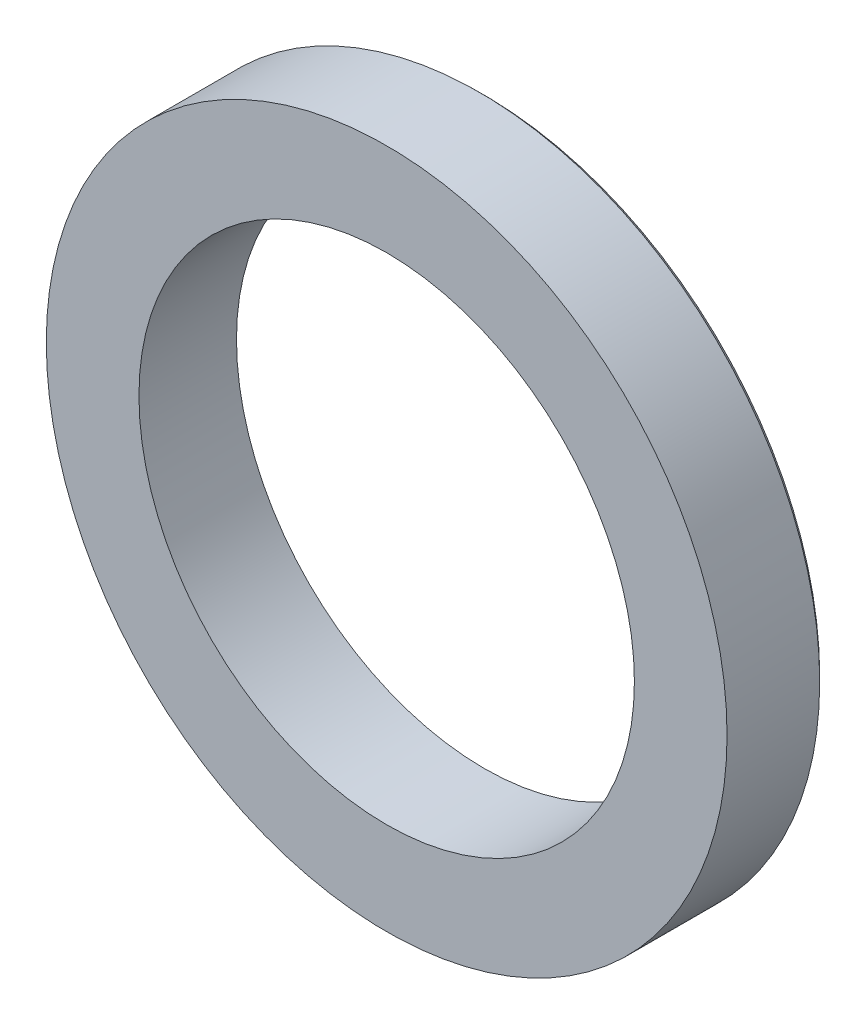
ISO-10303-21;
HEADER;
FILE_DESCRIPTION(('STEP AP214'),'2;1');
FILE_NAME('part.step','',(''),(''),'','','');
FILE_SCHEMA(('AUTOMOTIVE_DESIGN { 1 0 10303 214 1 1 1 1 }'));
ENDSEC;
DATA;
#1=APPLICATION_CONTEXT('core data for automotive mechanical design processes');
#2=APPLICATION_PROTOCOL_DEFINITION('international standard','automotive_design',2000,#1);
#3=PRODUCT_CONTEXT('',#1,'mechanical');
#4=PRODUCT('Part','Part','',(#3));
#5=PRODUCT_RELATED_PRODUCT_CATEGORY('part','',(#4));
#6=PRODUCT_DEFINITION_FORMATION('','',#4);
#7=PRODUCT_DEFINITION_CONTEXT('part definition',#1,'design');
#8=PRODUCT_DEFINITION('design','',#6,#7);
#9=PRODUCT_DEFINITION_SHAPE('','',#8);
#10=(LENGTH_UNIT() NAMED_UNIT(*) SI_UNIT(.MILLI.,.METRE.));
#11=(NAMED_UNIT(*) PLANE_ANGLE_UNIT() SI_UNIT($,.RADIAN.));
#12=(NAMED_UNIT(*) SI_UNIT($,.STERADIAN.) SOLID_ANGLE_UNIT());
#13=UNCERTAINTY_MEASURE_WITH_UNIT(LENGTH_MEASURE(1.E-05),#10,'distance_accuracy_value','');
#14=(GEOMETRIC_REPRESENTATION_CONTEXT(3) GLOBAL_UNCERTAINTY_ASSIGNED_CONTEXT((#13)) GLOBAL_UNIT_ASSIGNED_CONTEXT((#10,
#11,#12)) REPRESENTATION_CONTEXT('',''));
#15=CARTESIAN_POINT('',(0.,0.,0.));
#16=DIRECTION('',(0.,0.,1.));
#17=DIRECTION('',(1.,0.,0.));
#18=AXIS2_PLACEMENT_3D('',#15,#16,#17);
#19=CARTESIAN_POINT('',(0.,0.,0.));
#20=DIRECTION('',(0.,0.,1.));
#21=DIRECTION('',(1.,0.,0.));
#22=AXIS2_PLACEMENT_3D('',#19,#20,#21);
#23=PLANE('',#22);
#24=CARTESIAN_POINT('',(0.,0.,0.));
#25=DIRECTION('',(0.,0.,1.));
#26=DIRECTION('',(1.,0.,0.));
#27=AXIS2_PLACEMENT_3D('',#24,#25,#26);
#28=CIRCLE('',#27,17.2);
#29=CARTESIAN_POINT('',(17.2,0.,0.));
#30=VERTEX_POINT('',#29);
#31=EDGE_CURVE('E10',#30,#30,#28,.F.);
#32=ORIENTED_EDGE('',*,*,#31,.T.);
#33=EDGE_LOOP('',(#32));
#34=FACE_BOUND('',#33,.T.);
#35=CARTESIAN_POINT('',(0.,0.,0.));
#36=DIRECTION('',(0.,0.,1.));
#37=DIRECTION('',(1.,0.,0.));
#38=AXIS2_PLACEMENT_3D('',#35,#36,#37);
#39=CIRCLE('',#38,12.7);
#40=CARTESIAN_POINT('',(12.7,0.,0.));
#41=VERTEX_POINT('',#40);
#42=EDGE_CURVE('E56',#41,#41,#39,.T.);
#43=ORIENTED_EDGE('',*,*,#42,.T.);
#44=EDGE_LOOP('',(#43));
#45=FACE_BOUND('',#44,.T.);
#46=ADVANCED_FACE('F41',(#34,#45),#23,.F.);
#47=CARTESIAN_POINT('',(0.,0.,5.));
#48=DIRECTION('',(0.,0.,-1.));
#49=DIRECTION('',(-1.,0.,0.));
#50=AXIS2_PLACEMENT_3D('',#47,#48,#49);
#51=CYLINDRICAL_SURFACE('',#50,17.45);
#52=CARTESIAN_POINT('',(0.,0.,0.25));
#53=DIRECTION('',(0.,0.,1.));
#54=DIRECTION('',(1.,0.,0.));
#55=AXIS2_PLACEMENT_3D('',#52,#53,#54);
#56=CIRCLE('',#55,17.45);
#57=CARTESIAN_POINT('',(17.45,0.,0.25));
#58=VERTEX_POINT('',#57);
#59=EDGE_CURVE('E48',#58,#58,#56,.T.);
#60=ORIENTED_EDGE('',*,*,#59,.T.);
#61=EDGE_LOOP('',(#60));
#62=FACE_BOUND('',#61,.T.);
#63=CARTESIAN_POINT('',(0.,0.,5.));
#64=DIRECTION('',(0.,0.,1.));
#65=DIRECTION('',(1.,0.,0.));
#66=AXIS2_PLACEMENT_3D('',#63,#64,#65);
#67=CIRCLE('',#66,17.45);
#68=CARTESIAN_POINT('',(17.45,0.,5.));
#69=VERTEX_POINT('',#68);
#70=EDGE_CURVE('E52',#69,#69,#67,.T.);
#71=ORIENTED_EDGE('',*,*,#70,.F.);
#72=EDGE_LOOP('',(#71));
#73=FACE_BOUND('',#72,.T.);
#74=ADVANCED_FACE('F71',(#62,#73),#51,.T.);
#75=CARTESIAN_POINT('',(0.,0.,5.));
#76=DIRECTION('',(0.,0.,1.));
#77=DIRECTION('',(1.,0.,0.));
#78=AXIS2_PLACEMENT_3D('',#75,#76,#77);
#79=PLANE('',#78);
#80=CARTESIAN_POINT('',(0.,0.,5.));
#81=DIRECTION('',(0.,0.,1.));
#82=DIRECTION('',(1.,0.,0.));
#83=AXIS2_PLACEMENT_3D('',#80,#81,#82);
#84=CIRCLE('',#83,12.7);
#85=CARTESIAN_POINT('',(12.7,0.,5.));
#86=VERTEX_POINT('',#85);
#87=EDGE_CURVE('E61',#86,#86,#84,.T.);
#88=ORIENTED_EDGE('',*,*,#87,.F.);
#89=EDGE_LOOP('',(#88));
#90=FACE_BOUND('',#89,.T.);
#91=ORIENTED_EDGE('',*,*,#70,.T.);
#92=EDGE_LOOP('',(#91));
#93=FACE_BOUND('',#92,.T.);
#94=ADVANCED_FACE('F68',(#90,#93),#79,.T.);
#95=CARTESIAN_POINT('',(0.,0.,-6.3));
#96=DIRECTION('',(0.,0.,1.));
#97=DIRECTION('',(1.,0.,0.));
#98=AXIS2_PLACEMENT_3D('',#95,#96,#97);
#99=CYLINDRICAL_SURFACE('',#98,12.7);
#100=ORIENTED_EDGE('',*,*,#87,.T.);
#101=EDGE_LOOP('',(#100));
#102=FACE_BOUND('',#101,.T.);
#103=ORIENTED_EDGE('',*,*,#42,.F.);
#104=EDGE_LOOP('',(#103));
#105=FACE_BOUND('',#104,.T.);
#106=ADVANCED_FACE('F65',(#102,#105),#99,.F.);
#107=CARTESIAN_POINT('',(0.,0.,0.25));
#108=DIRECTION('',(0.,0.,1.));
#109=DIRECTION('',(1.,0.,0.));
#110=AXIS2_PLACEMENT_3D('',#107,#108,#109);
#111=CONICAL_SURFACE('',#110,17.45,0.785398163397441);
#112=ORIENTED_EDGE('',*,*,#31,.F.);
#113=EDGE_LOOP('',(#112));
#114=FACE_BOUND('',#113,.T.);
#115=ORIENTED_EDGE('',*,*,#59,.F.);
#116=EDGE_LOOP('',(#115));
#117=FACE_BOUND('',#116,.T.);
#118=ADVANCED_FACE('F43',(#114,#117),#111,.T.);
#119=CLOSED_SHELL('',(#46,#74,#94,#106,#118));
#120=MANIFOLD_SOLID_BREP('B2',#119);
#121=ADVANCED_BREP_SHAPE_REPRESENTATION('',(#18,#120),#14);
#122=SHAPE_DEFINITION_REPRESENTATION(#9,#121);
ENDSEC;
END-ISO-10303-21;
